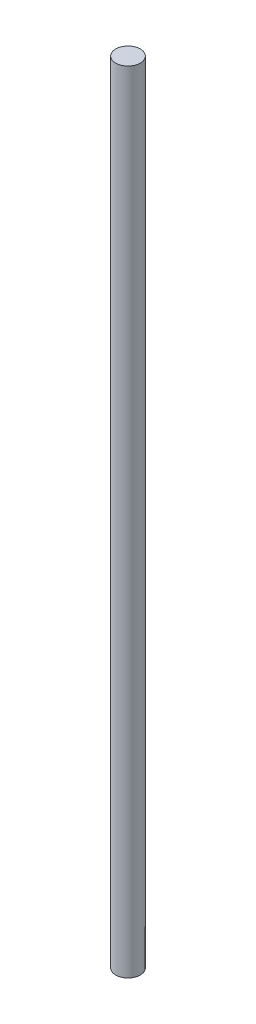
ISO-10303-21;
HEADER;
FILE_DESCRIPTION(('STEP AP214'),'2;1');
FILE_NAME('part.step','',(''),(''),'','','');
FILE_SCHEMA(('AUTOMOTIVE_DESIGN { 1 0 10303 214 1 1 1 1 }'));
ENDSEC;
DATA;
#1=APPLICATION_CONTEXT('core data for automotive mechanical design processes');
#2=APPLICATION_PROTOCOL_DEFINITION('international standard','automotive_design',2000,#1);
#3=PRODUCT_CONTEXT('',#1,'mechanical');
#4=PRODUCT('Part','Part','',(#3));
#5=PRODUCT_RELATED_PRODUCT_CATEGORY('part','',(#4));
#6=PRODUCT_DEFINITION_FORMATION('','',#4);
#7=PRODUCT_DEFINITION_CONTEXT('part definition',#1,'design');
#8=PRODUCT_DEFINITION('design','',#6,#7);
#9=PRODUCT_DEFINITION_SHAPE('','',#8);
#10=(LENGTH_UNIT() NAMED_UNIT(*) SI_UNIT(.MILLI.,.METRE.));
#11=(NAMED_UNIT(*) PLANE_ANGLE_UNIT() SI_UNIT($,.RADIAN.));
#12=(NAMED_UNIT(*) SI_UNIT($,.STERADIAN.) SOLID_ANGLE_UNIT());
#13=UNCERTAINTY_MEASURE_WITH_UNIT(LENGTH_MEASURE(1.E-05),#10,'distance_accuracy_value','');
#14=(GEOMETRIC_REPRESENTATION_CONTEXT(3) GLOBAL_UNCERTAINTY_ASSIGNED_CONTEXT((#13)) GLOBAL_UNIT_ASSIGNED_CONTEXT((#10,
#11,#12)) REPRESENTATION_CONTEXT('',''));
#15=CARTESIAN_POINT('',(0.,0.,0.));
#16=DIRECTION('',(0.,0.,1.));
#17=DIRECTION('',(1.,0.,0.));
#18=AXIS2_PLACEMENT_3D('',#15,#16,#17);
#19=CARTESIAN_POINT('',(0.,257.,0.));
#20=DIRECTION('',(0.,-1.,0.));
#21=DIRECTION('',(0.,0.,-1.));
#22=AXIS2_PLACEMENT_3D('',#19,#20,#21);
#23=CYLINDRICAL_SURFACE('',#22,4.);
#24=CARTESIAN_POINT('',(0.,257.,0.));
#25=DIRECTION('',(0.,1.,0.));
#26=DIRECTION('',(0.,0.,1.));
#27=AXIS2_PLACEMENT_3D('',#24,#25,#26);
#28=CIRCLE('',#27,4.);
#29=CARTESIAN_POINT('',(0.,257.,4.));
#30=VERTEX_POINT('',#29);
#31=EDGE_CURVE('E10',#30,#30,#28,.T.);
#32=ORIENTED_EDGE('',*,*,#31,.F.);
#33=EDGE_LOOP('',(#32));
#34=FACE_BOUND('',#33,.T.);
#35=CARTESIAN_POINT('',(0.,0.,0.));
#36=DIRECTION('',(0.,1.,0.));
#37=DIRECTION('',(0.,0.,1.));
#38=AXIS2_PLACEMENT_3D('',#35,#36,#37);
#39=CIRCLE('',#38,4.);
#40=CARTESIAN_POINT('',(0.,0.,4.));
#41=VERTEX_POINT('',#40);
#42=EDGE_CURVE('E36',#41,#41,#39,.T.);
#43=ORIENTED_EDGE('',*,*,#42,.T.);
#44=EDGE_LOOP('',(#43));
#45=FACE_BOUND('',#44,.T.);
#46=ADVANCED_FACE('F33',(#34,#45),#23,.T.);
#47=CARTESIAN_POINT('',(0.,257.,0.));
#48=DIRECTION('',(0.,1.,0.));
#49=DIRECTION('',(0.,0.,1.));
#50=AXIS2_PLACEMENT_3D('',#47,#48,#49);
#51=PLANE('',#50);
#52=ORIENTED_EDGE('',*,*,#31,.T.);
#53=EDGE_LOOP('',(#52));
#54=FACE_BOUND('',#53,.T.);
#55=ADVANCED_FACE('F48',(#54),#51,.T.);
#56=CARTESIAN_POINT('',(0.,0.,0.));
#57=DIRECTION('',(0.,1.,0.));
#58=DIRECTION('',(0.,0.,1.));
#59=AXIS2_PLACEMENT_3D('',#56,#57,#58);
#60=PLANE('',#59);
#61=ORIENTED_EDGE('',*,*,#42,.F.);
#62=EDGE_LOOP('',(#61));
#63=FACE_BOUND('',#62,.T.);
#64=ADVANCED_FACE('F46',(#63),#60,.F.);
#65=CLOSED_SHELL('',(#46,#55,#64));
#66=MANIFOLD_SOLID_BREP('B2',#65);
#67=ADVANCED_BREP_SHAPE_REPRESENTATION('',(#18,#66),#14);
#68=SHAPE_DEFINITION_REPRESENTATION(#9,#67);
ENDSEC;
END-ISO-10303-21;
